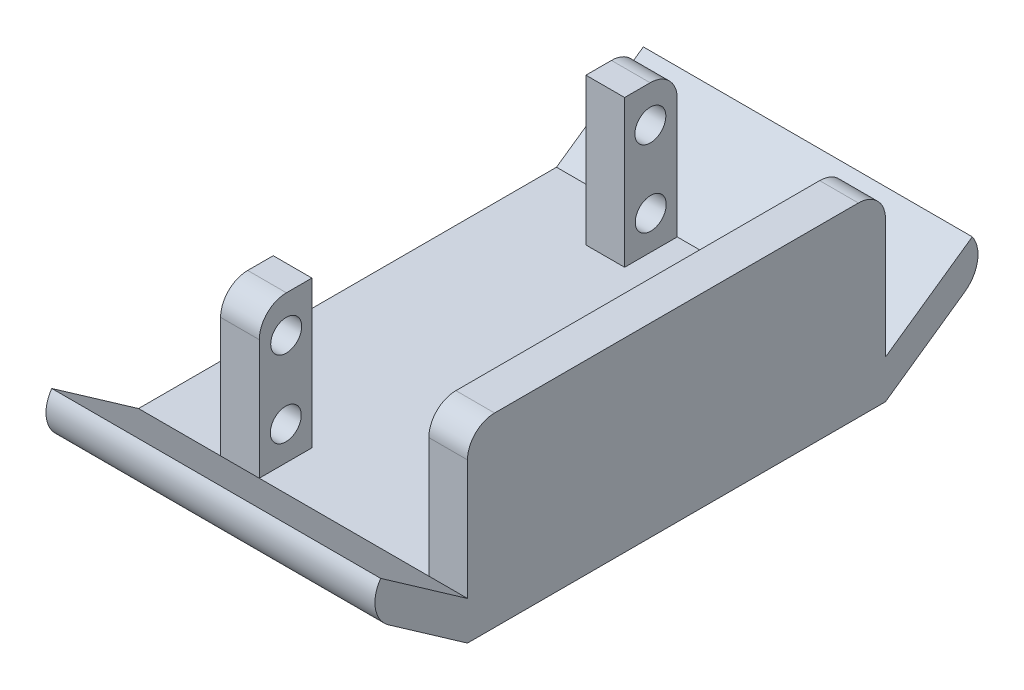
ISO-10303-21;
HEADER;
FILE_DESCRIPTION(('STEP AP214'),'2;1');
FILE_NAME('part.step','',(''),(''),'','','');
FILE_SCHEMA(('AUTOMOTIVE_DESIGN { 1 0 10303 214 1 1 1 1 }'));
ENDSEC;
DATA;
#1=APPLICATION_CONTEXT('core data for automotive mechanical design processes');
#2=APPLICATION_PROTOCOL_DEFINITION('international standard','automotive_design',2000,#1);
#3=PRODUCT_CONTEXT('',#1,'mechanical');
#4=PRODUCT('Part','Part','',(#3));
#5=PRODUCT_RELATED_PRODUCT_CATEGORY('part','',(#4));
#6=PRODUCT_DEFINITION_FORMATION('','',#4);
#7=PRODUCT_DEFINITION_CONTEXT('part definition',#1,'design');
#8=PRODUCT_DEFINITION('design','',#6,#7);
#9=PRODUCT_DEFINITION_SHAPE('','',#8);
#10=(LENGTH_UNIT() NAMED_UNIT(*) SI_UNIT(.MILLI.,.METRE.));
#11=(NAMED_UNIT(*) PLANE_ANGLE_UNIT() SI_UNIT($,.RADIAN.));
#12=(NAMED_UNIT(*) SI_UNIT($,.STERADIAN.) SOLID_ANGLE_UNIT());
#13=UNCERTAINTY_MEASURE_WITH_UNIT(LENGTH_MEASURE(1.E-05),#10,'distance_accuracy_value','');
#14=(GEOMETRIC_REPRESENTATION_CONTEXT(3) GLOBAL_UNCERTAINTY_ASSIGNED_CONTEXT((#13)) GLOBAL_UNIT_ASSIGNED_CONTEXT((#10,
#11,#12)) REPRESENTATION_CONTEXT('',''));
#15=CARTESIAN_POINT('',(0.,0.,0.));
#16=DIRECTION('',(0.,0.,1.));
#17=DIRECTION('',(1.,0.,0.));
#18=AXIS2_PLACEMENT_3D('',#15,#16,#17);
#19=CARTESIAN_POINT('',(31.9,-5.,-6.8));
#20=DIRECTION('',(0.,0.,-1.));
#21=DIRECTION('',(-1.,0.,0.));
#22=AXIS2_PLACEMENT_3D('',#19,#20,#21);
#23=PLANE('',#22);
#24=DIRECTION('',(-1.,0.,0.));
#25=VECTOR('',#24,1.);
#26=CARTESIAN_POINT('',(31.9,0.,-6.8));
#27=LINE('',#26,#25);
#28=CARTESIAN_POINT('',(5.00000000000001,0.,-6.8));
#29=VERTEX_POINT('',#28);
#30=CARTESIAN_POINT('',(0.,0.,-6.8));
#31=VERTEX_POINT('',#30);
#32=EDGE_CURVE('E207',#29,#31,#27,.T.);
#33=ORIENTED_EDGE('',*,*,#32,.T.);
#34=DIRECTION('',(0.,-1.,0.));
#35=VECTOR('',#34,1.);
#36=CARTESIAN_POINT('',(0.,19.,-6.8));
#37=LINE('',#36,#35);
#38=CARTESIAN_POINT('',(0.,15.5,-6.8));
#39=VERTEX_POINT('',#38);
#40=EDGE_CURVE('E295',#39,#31,#37,.T.);
#41=ORIENTED_EDGE('',*,*,#40,.F.);
#42=DIRECTION('',(-1.,0.,0.));
#43=VECTOR('',#42,1.);
#44=CARTESIAN_POINT('',(31.9,15.5,-6.8));
#45=LINE('',#44,#43);
#46=CARTESIAN_POINT('',(5.00000000000001,15.5,-6.8));
#47=VERTEX_POINT('',#46);
#48=EDGE_CURVE('E332',#39,#47,#45,.F.);
#49=ORIENTED_EDGE('',*,*,#48,.T.);
#50=DIRECTION('',(0.,-1.,0.));
#51=VECTOR('',#50,1.);
#52=CARTESIAN_POINT('',(5.00000000000001,19.,-6.8));
#53=LINE('',#52,#51);
#54=EDGE_CURVE('E280',#47,#29,#53,.T.);
#55=ORIENTED_EDGE('',*,*,#54,.T.);
#56=EDGE_LOOP('',(#33,#41,#49,#55));
#57=FACE_BOUND('',#56,.T.);
#58=ADVANCED_FACE('F33',(#57),#23,.T.);
#59=CARTESIAN_POINT('',(31.9,-5.,47.2));
#60=DIRECTION('',(0.,0.,1.));
#61=DIRECTION('',(1.,0.,0.));
#62=AXIS2_PLACEMENT_3D('',#59,#60,#61);
#63=PLANE('',#62);
#64=DIRECTION('',(-1.,0.,0.));
#65=VECTOR('',#64,1.);
#66=CARTESIAN_POINT('',(31.9,0.,47.2));
#67=LINE('',#66,#65);
#68=CARTESIAN_POINT('',(31.9,0.,47.2));
#69=VERTEX_POINT('',#68);
#70=CARTESIAN_POINT('',(26.9,0.,47.2));
#71=VERTEX_POINT('',#70);
#72=EDGE_CURVE('E226',#69,#71,#67,.T.);
#73=ORIENTED_EDGE('',*,*,#72,.F.);
#74=DIRECTION('',(0.,1.,0.));
#75=VECTOR('',#74,1.);
#76=CARTESIAN_POINT('',(31.9,-5.,47.2));
#77=LINE('',#76,#75);
#78=CARTESIAN_POINT('',(31.9,15.5,47.2));
#79=VERTEX_POINT('',#78);
#80=EDGE_CURVE('E319',#69,#79,#77,.T.);
#81=ORIENTED_EDGE('',*,*,#80,.T.);
#82=DIRECTION('',(1.,0.,0.));
#83=VECTOR('',#82,1.);
#84=CARTESIAN_POINT('',(26.9,15.5,47.2));
#85=LINE('',#84,#83);
#86=CARTESIAN_POINT('',(26.9,15.5,47.2));
#87=VERTEX_POINT('',#86);
#88=EDGE_CURVE('E354',#79,#87,#85,.F.);
#89=ORIENTED_EDGE('',*,*,#88,.T.);
#90=DIRECTION('',(0.,-1.,0.));
#91=VECTOR('',#90,1.);
#92=CARTESIAN_POINT('',(26.9,19.,47.2));
#93=LINE('',#92,#91);
#94=EDGE_CURVE('E239',#87,#71,#93,.T.);
#95=ORIENTED_EDGE('',*,*,#94,.T.);
#96=EDGE_LOOP('',(#73,#81,#89,#95));
#97=FACE_BOUND('',#96,.T.);
#98=ADVANCED_FACE('F454',(#97),#63,.T.);
#99=CARTESIAN_POINT('',(0.,0.,0.));
#100=DIRECTION('',(0.,1.,0.));
#101=DIRECTION('',(0.,0.,1.));
#102=AXIS2_PLACEMENT_3D('',#99,#100,#101);
#103=PLANE('',#102);
#104=DIRECTION('',(1.,0.,0.));
#105=VECTOR('',#104,1.);
#106=CARTESIAN_POINT('',(31.9,0.,47.2));
#107=LINE('',#106,#105);
#108=CARTESIAN_POINT('',(5.00000000000001,0.,47.2));
#109=VERTEX_POINT('',#108);
#110=EDGE_CURVE('E316',#109,#71,#107,.T.);
#111=ORIENTED_EDGE('',*,*,#110,.T.);
#112=DIRECTION('',(0.,0.,1.));
#113=VECTOR('',#112,1.);
#114=CARTESIAN_POINT('',(26.9,0.,-6.8));
#115=LINE('',#114,#113);
#116=CARTESIAN_POINT('',(26.9,0.,-6.8));
#117=VERTEX_POINT('',#116);
#118=EDGE_CURVE('E229',#117,#71,#115,.T.);
#119=ORIENTED_EDGE('',*,*,#118,.F.);
#120=DIRECTION('',(-1.,0.,0.));
#121=VECTOR('',#120,1.);
#122=CARTESIAN_POINT('',(31.9,0.,-6.8));
#123=LINE('',#122,#121);
#124=EDGE_CURVE('E311',#117,#29,#123,.T.);
#125=ORIENTED_EDGE('',*,*,#124,.T.);
#126=DIRECTION('',(0.,0.,-1.));
#127=VECTOR('',#126,1.);
#128=CARTESIAN_POINT('',(5.00000000000001,0.,0.));
#129=LINE('',#128,#127);
#130=CARTESIAN_POINT('',(5.00000000000001,0.,0.));
#131=VERTEX_POINT('',#130);
#132=EDGE_CURVE('E275',#131,#29,#129,.T.);
#133=ORIENTED_EDGE('',*,*,#132,.F.);
#134=DIRECTION('',(1.,0.,0.));
#135=VECTOR('',#134,1.);
#136=CARTESIAN_POINT('',(0.,0.,0.));
#137=LINE('',#136,#135);
#138=CARTESIAN_POINT('',(0.,0.,0.));
#139=VERTEX_POINT('',#138);
#140=EDGE_CURVE('E283',#139,#131,#137,.T.);
#141=ORIENTED_EDGE('',*,*,#140,.F.);
#142=DIRECTION('',(0.,0.,1.));
#143=VECTOR('',#142,1.);
#144=CARTESIAN_POINT('',(0.,0.,0.));
#145=LINE('',#144,#143);
#146=EDGE_CURVE('E271',#31,#139,#145,.T.);
#147=ORIENTED_EDGE('',*,*,#146,.F.);
#148=CARTESIAN_POINT('',(-10.6,0.,-6.8));
#149=VERTEX_POINT('',#148);
#150=EDGE_CURVE('E298',#31,#149,#123,.T.);
#151=ORIENTED_EDGE('',*,*,#150,.T.);
#152=DIRECTION('',(0.,0.,1.));
#153=VECTOR('',#152,1.);
#154=CARTESIAN_POINT('',(-10.6,0.,47.2));
#155=LINE('',#154,#153);
#156=CARTESIAN_POINT('',(-10.6,0.,47.2));
#157=VERTEX_POINT('',#156);
#158=EDGE_CURVE('E314',#149,#157,#155,.T.);
#159=ORIENTED_EDGE('',*,*,#158,.T.);
#160=CARTESIAN_POINT('',(0.,0.,47.2));
#161=VERTEX_POINT('',#160);
#162=EDGE_CURVE('E302',#157,#161,#107,.T.);
#163=ORIENTED_EDGE('',*,*,#162,.T.);
#164=DIRECTION('',(0.,0.,1.));
#165=VECTOR('',#164,1.);
#166=CARTESIAN_POINT('',(0.,0.,40.4));
#167=LINE('',#166,#165);
#168=CARTESIAN_POINT('',(0.,0.,40.4));
#169=VERTEX_POINT('',#168);
#170=EDGE_CURVE('E246',#169,#161,#167,.T.);
#171=ORIENTED_EDGE('',*,*,#170,.F.);
#172=DIRECTION('',(-1.,0.,0.));
#173=VECTOR('',#172,1.);
#174=CARTESIAN_POINT('',(0.,0.,40.4));
#175=LINE('',#174,#173);
#176=CARTESIAN_POINT('',(5.00000000000001,0.,40.4));
#177=VERTEX_POINT('',#176);
#178=EDGE_CURVE('E251',#177,#169,#175,.T.);
#179=ORIENTED_EDGE('',*,*,#178,.F.);
#180=DIRECTION('',(0.,0.,-1.));
#181=VECTOR('',#180,1.);
#182=CARTESIAN_POINT('',(5.00000000000001,0.,40.4));
#183=LINE('',#182,#181);
#184=EDGE_CURVE('E258',#109,#177,#183,.T.);
#185=ORIENTED_EDGE('',*,*,#184,.F.);
#186=EDGE_LOOP('',(#111,#119,#125,#133,#141,#147,#151,#159,#163,#171,#179,#185));
#187=FACE_BOUND('',#186,.T.);
#188=ADVANCED_FACE('F385',(#187),#103,.T.);
#189=CARTESIAN_POINT('',(31.9,-5.,47.2));
#190=DIRECTION('',(1.,0.,0.));
#191=DIRECTION('',(0.,0.,-1.));
#192=AXIS2_PLACEMENT_3D('',#189,#190,#191);
#193=PLANE('',#192);
#194=DIRECTION('',(0.,-0.57357643635105,-0.819152044288989));
#195=VECTOR('',#194,1.);
#196=CARTESIAN_POINT('',(31.9,7.85505035831426,58.4181745120853));
#197=LINE('',#196,#195);
#198=CARTESIAN_POINT('',(31.9,7.85505035831426,58.4181745120853));
#199=VERTEX_POINT('',#198);
#200=EDGE_CURVE('E216',#199,#69,#197,.T.);
#201=ORIENTED_EDGE('',*,*,#200,.F.);
#202=CARTESIAN_POINT('',(31.9,5.50686124991796,55.0572210891398));
#203=DIRECTION('',(1.,0.,0.));
#204=DIRECTION('',(0.,0.,-1.));
#205=AXIS2_PLACEMENT_3D('',#202,#203,#204);
#206=CIRCLE('',#205,4.1);
#207=CARTESIAN_POINT('',(31.9,2.14833786833309,57.4088844781791));
#208=VERTEX_POINT('',#207);
#209=EDGE_CURVE('E41',#199,#208,#206,.T.);
#210=ORIENTED_EDGE('',*,*,#209,.T.);
#211=DIRECTION('',(0.,0.573576436351044,0.819152044288993));
#212=VECTOR('',#211,1.);
#213=CARTESIAN_POINT('',(31.9,-5.,47.2));
#214=LINE('',#213,#212);
#215=CARTESIAN_POINT('',(31.9,-5.,47.2));
#216=VERTEX_POINT('',#215);
#217=EDGE_CURVE('E213',#216,#208,#214,.T.);
#218=ORIENTED_EDGE('',*,*,#217,.F.);
#219=DIRECTION('',(0.,0.,-1.));
#220=VECTOR('',#219,1.);
#221=CARTESIAN_POINT('',(31.9,-5.,47.2));
#222=LINE('',#221,#220);
#223=CARTESIAN_POINT('',(31.9,-5.,-6.8));
#224=VERTEX_POINT('',#223);
#225=EDGE_CURVE('E299',#216,#224,#222,.T.);
#226=ORIENTED_EDGE('',*,*,#225,.T.);
#227=DIRECTION('',(0.,-0.573576436351044,0.819152044288993));
#228=VECTOR('',#227,1.);
#229=CARTESIAN_POINT('',(31.9,-5.00000000000002,-6.8));
#230=LINE('',#229,#228);
#231=CARTESIAN_POINT('',(31.9,2.14833786833306,-17.0088844781791));
#232=VERTEX_POINT('',#231);
#233=EDGE_CURVE('E192',#232,#224,#230,.T.);
#234=ORIENTED_EDGE('',*,*,#233,.F.);
#235=CARTESIAN_POINT('',(31.9,5.50686124991794,-14.6572210891398));
#236=DIRECTION('',(1.,0.,0.));
#237=DIRECTION('',(0.,0.,-1.));
#238=AXIS2_PLACEMENT_3D('',#235,#236,#237);
#239=CIRCLE('',#238,4.1);
#240=CARTESIAN_POINT('',(31.9,7.85505035831424,-18.0181745120853));
#241=VERTEX_POINT('',#240);
#242=EDGE_CURVE('E186',#232,#241,#239,.T.);
#243=ORIENTED_EDGE('',*,*,#242,.T.);
#244=DIRECTION('',(0.,0.57357643635105,-0.819152044288989));
#245=VECTOR('',#244,1.);
#246=CARTESIAN_POINT('',(31.9,7.85505035831424,-18.0181745120853));
#247=LINE('',#246,#245);
#248=CARTESIAN_POINT('',(31.9,0.,-6.8));
#249=VERTEX_POINT('',#248);
#250=EDGE_CURVE('E190',#249,#241,#247,.T.);
#251=ORIENTED_EDGE('',*,*,#250,.F.);
#252=DIRECTION('',(0.,1.,0.));
#253=VECTOR('',#252,1.);
#254=CARTESIAN_POINT('',(31.9,-5.,-6.8));
#255=LINE('',#254,#253);
#256=CARTESIAN_POINT('',(31.9,15.5,-6.8));
#257=VERTEX_POINT('',#256);
#258=EDGE_CURVE('E310',#249,#257,#255,.T.);
#259=ORIENTED_EDGE('',*,*,#258,.T.);
#260=CARTESIAN_POINT('',(31.9,15.5,-3.3));
#261=DIRECTION('',(1.,0.,0.));
#262=DIRECTION('',(0.,0.,-1.));
#263=AXIS2_PLACEMENT_3D('',#260,#261,#262);
#264=CIRCLE('',#263,3.5);
#265=CARTESIAN_POINT('',(31.9,19.,-3.3));
#266=VERTEX_POINT('',#265);
#267=EDGE_CURVE('E340',#257,#266,#264,.T.);
#268=ORIENTED_EDGE('',*,*,#267,.T.);
#269=DIRECTION('',(0.,0.,-1.));
#270=VECTOR('',#269,1.);
#271=CARTESIAN_POINT('',(31.9,19.,-6.8));
#272=LINE('',#271,#270);
#273=CARTESIAN_POINT('',(31.9,19.,43.7));
#274=VERTEX_POINT('',#273);
#275=EDGE_CURVE('E233',#274,#266,#272,.T.);
#276=ORIENTED_EDGE('',*,*,#275,.F.);
#277=CARTESIAN_POINT('',(31.9,15.5,43.7));
#278=DIRECTION('',(1.,0.,0.));
#279=DIRECTION('',(0.,0.,-1.));
#280=AXIS2_PLACEMENT_3D('',#277,#278,#279);
#281=CIRCLE('',#280,3.5);
#282=EDGE_CURVE('E337',#274,#79,#281,.T.);
#283=ORIENTED_EDGE('',*,*,#282,.T.);
#284=ORIENTED_EDGE('',*,*,#80,.F.);
#285=EDGE_LOOP('',(#201,#210,#218,#226,#234,#243,#251,#259,#268,#276,#283,#284));
#286=FACE_BOUND('',#285,.T.);
#287=ADVANCED_FACE('F189',(#286),#193,.T.);
#288=EDGE_CURVE('E230',#109,#161,#67,.T.);
#289=ORIENTED_EDGE('',*,*,#288,.F.);
#290=DIRECTION('',(0.,-1.,0.));
#291=VECTOR('',#290,1.);
#292=CARTESIAN_POINT('',(5.00000000000001,19.,47.2));
#293=LINE('',#292,#291);
#294=CARTESIAN_POINT('',(5.00000000000001,15.5,47.2));
#295=VERTEX_POINT('',#294);
#296=EDGE_CURVE('E266',#295,#109,#293,.T.);
#297=ORIENTED_EDGE('',*,*,#296,.F.);
#298=DIRECTION('',(1.,0.,0.));
#299=VECTOR('',#298,1.);
#300=CARTESIAN_POINT('',(31.9,15.5,47.2));
#301=LINE('',#300,#299);
#302=CARTESIAN_POINT('',(0.,15.5,47.2));
#303=VERTEX_POINT('',#302);
#304=EDGE_CURVE('E356',#295,#303,#301,.F.);
#305=ORIENTED_EDGE('',*,*,#304,.T.);
#306=DIRECTION('',(0.,-1.,0.));
#307=VECTOR('',#306,1.);
#308=CARTESIAN_POINT('',(0.,19.,47.2));
#309=LINE('',#308,#307);
#310=EDGE_CURVE('E269',#303,#161,#309,.T.);
#311=ORIENTED_EDGE('',*,*,#310,.T.);
#312=EDGE_LOOP('',(#289,#297,#305,#311));
#313=FACE_BOUND('',#312,.T.);
#314=ADVANCED_FACE('F504',(#313),#63,.T.);
#315=CARTESIAN_POINT('',(-10.6,-5.,47.2));
#316=DIRECTION('',(-1.,0.,0.));
#317=DIRECTION('',(0.,0.,1.));
#318=AXIS2_PLACEMENT_3D('',#315,#316,#317);
#319=PLANE('',#318);
#320=DIRECTION('',(0.,0.573576436351044,0.819152044288993));
#321=VECTOR('',#320,1.);
#322=CARTESIAN_POINT('',(-10.6,-5.,47.2));
#323=LINE('',#322,#321);
#324=CARTESIAN_POINT('',(-10.6,-5.,47.2));
#325=VERTEX_POINT('',#324);
#326=CARTESIAN_POINT('',(-10.6,2.14833786833309,57.4088844781791));
#327=VERTEX_POINT('',#326);
#328=EDGE_CURVE('E221',#325,#327,#323,.T.);
#329=ORIENTED_EDGE('',*,*,#328,.T.);
#330=CARTESIAN_POINT('',(-10.6,5.50686124991796,55.0572210891398));
#331=DIRECTION('',(-1.,0.,0.));
#332=DIRECTION('',(0.,0.,1.));
#333=AXIS2_PLACEMENT_3D('',#330,#331,#332);
#334=CIRCLE('',#333,4.1);
#335=CARTESIAN_POINT('',(-10.6,7.85505035831426,58.4181745120853));
#336=VERTEX_POINT('',#335);
#337=EDGE_CURVE('E195',#327,#336,#334,.T.);
#338=ORIENTED_EDGE('',*,*,#337,.T.);
#339=DIRECTION('',(0.,-0.57357643635105,-0.819152044288989));
#340=VECTOR('',#339,1.);
#341=CARTESIAN_POINT('',(-10.6,7.85505035831426,58.4181745120853));
#342=LINE('',#341,#340);
#343=EDGE_CURVE('E217',#336,#157,#342,.T.);
#344=ORIENTED_EDGE('',*,*,#343,.T.);
#345=ORIENTED_EDGE('',*,*,#158,.F.);
#346=DIRECTION('',(0.,0.57357643635105,-0.819152044288989));
#347=VECTOR('',#346,1.);
#348=CARTESIAN_POINT('',(-10.6,7.85505035831424,-18.0181745120853));
#349=LINE('',#348,#347);
#350=CARTESIAN_POINT('',(-10.6,7.85505035831424,-18.0181745120853));
#351=VERTEX_POINT('',#350);
#352=EDGE_CURVE('E389',#149,#351,#349,.T.);
#353=ORIENTED_EDGE('',*,*,#352,.T.);
#354=CARTESIAN_POINT('',(-10.6,5.50686124991794,-14.6572210891398));
#355=DIRECTION('',(-1.,0.,0.));
#356=DIRECTION('',(0.,0.,1.));
#357=AXIS2_PLACEMENT_3D('',#354,#355,#356);
#358=CIRCLE('',#357,4.1);
#359=CARTESIAN_POINT('',(-10.6,2.14833786833307,-17.0088844781791));
#360=VERTEX_POINT('',#359);
#361=EDGE_CURVE('E54',#351,#360,#358,.T.);
#362=ORIENTED_EDGE('',*,*,#361,.T.);
#363=DIRECTION('',(0.,-0.573576436351044,0.819152044288993));
#364=VECTOR('',#363,1.);
#365=CARTESIAN_POINT('',(-10.6,-5.00000000000002,-6.8));
#366=LINE('',#365,#364);
#367=CARTESIAN_POINT('',(-10.6,-5.00000000000002,-6.8));
#368=VERTEX_POINT('',#367);
#369=EDGE_CURVE('E205',#360,#368,#366,.T.);
#370=ORIENTED_EDGE('',*,*,#369,.T.);
#371=DIRECTION('',(0.,0.,1.));
#372=VECTOR('',#371,1.);
#373=CARTESIAN_POINT('',(-10.6,-5.,47.2));
#374=LINE('',#373,#372);
#375=EDGE_CURVE('E305',#368,#325,#374,.T.);
#376=ORIENTED_EDGE('',*,*,#375,.T.);
#377=EDGE_LOOP('',(#329,#338,#344,#345,#353,#362,#370,#376));
#378=FACE_BOUND('',#377,.T.);
#379=ADVANCED_FACE('F375',(#378),#319,.T.);
#380=EDGE_CURVE('E204',#249,#117,#27,.T.);
#381=ORIENTED_EDGE('',*,*,#380,.T.);
#382=DIRECTION('',(0.,-1.,0.));
#383=VECTOR('',#382,1.);
#384=CARTESIAN_POINT('',(26.9,19.,-6.8));
#385=LINE('',#384,#383);
#386=CARTESIAN_POINT('',(26.9,15.5,-6.8));
#387=VERTEX_POINT('',#386);
#388=EDGE_CURVE('E243',#387,#117,#385,.T.);
#389=ORIENTED_EDGE('',*,*,#388,.F.);
#390=DIRECTION('',(-1.,0.,0.));
#391=VECTOR('',#390,1.);
#392=CARTESIAN_POINT('',(31.9,15.5,-6.8));
#393=LINE('',#392,#391);
#394=EDGE_CURVE('E334',#387,#257,#393,.F.);
#395=ORIENTED_EDGE('',*,*,#394,.T.);
#396=ORIENTED_EDGE('',*,*,#258,.F.);
#397=EDGE_LOOP('',(#381,#389,#395,#396));
#398=FACE_BOUND('',#397,.T.);
#399=ADVANCED_FACE('F499',(#398),#23,.T.);
#400=CARTESIAN_POINT('',(0.,-5.,0.));
#401=DIRECTION('',(0.,1.,0.));
#402=DIRECTION('',(0.,0.,1.));
#403=AXIS2_PLACEMENT_3D('',#400,#401,#402);
#404=PLANE('',#403);
#405=ORIENTED_EDGE('',*,*,#225,.F.);
#406=DIRECTION('',(1.,0.,0.));
#407=VECTOR('',#406,1.);
#408=CARTESIAN_POINT('',(31.9,-5.,47.2));
#409=LINE('',#408,#407);
#410=EDGE_CURVE('E307',#325,#216,#409,.T.);
#411=ORIENTED_EDGE('',*,*,#410,.F.);
#412=ORIENTED_EDGE('',*,*,#375,.F.);
#413=DIRECTION('',(-1.,0.,0.));
#414=VECTOR('',#413,1.);
#415=CARTESIAN_POINT('',(31.9,-5.,-6.8));
#416=LINE('',#415,#414);
#417=EDGE_CURVE('E301',#224,#368,#416,.T.);
#418=ORIENTED_EDGE('',*,*,#417,.F.);
#419=EDGE_LOOP('',(#405,#411,#412,#418));
#420=FACE_BOUND('',#419,.T.);
#421=ADVANCED_FACE('F508',(#420),#404,.F.);
#422=CARTESIAN_POINT('',(0.,19.,0.));
#423=DIRECTION('',(1.,0.,0.));
#424=DIRECTION('',(0.,0.,-1.));
#425=AXIS2_PLACEMENT_3D('',#422,#423,#424);
#426=PLANE('',#425);
#427=CARTESIAN_POINT('',(0.,4.35890483515786,-3.37705839560443));
#428=DIRECTION('',(-1.,0.,0.));
#429=DIRECTION('',(0.,0.,1.));
#430=AXIS2_PLACEMENT_3D('',#427,#428,#429);
#431=CIRCLE('',#430,2.);
#432=CARTESIAN_POINT('',(0.,4.35890483515786,-1.37705839560443));
#433=VERTEX_POINT('',#432);
#434=EDGE_CURVE('E407',#433,#433,#431,.T.);
#435=ORIENTED_EDGE('',*,*,#434,.F.);
#436=EDGE_LOOP('',(#435));
#437=FACE_BOUND('',#436,.T.);
#438=CARTESIAN_POINT('',(0.,14.2589048351579,-3.32495313244653));
#439=DIRECTION('',(-1.,0.,0.));
#440=DIRECTION('',(0.,0.,1.));
#441=AXIS2_PLACEMENT_3D('',#438,#439,#440);
#442=CIRCLE('',#441,2.);
#443=CARTESIAN_POINT('',(0.,14.2589048351579,-1.32495313244653));
#444=VERTEX_POINT('',#443);
#445=EDGE_CURVE('E394',#444,#444,#442,.T.);
#446=ORIENTED_EDGE('',*,*,#445,.F.);
#447=EDGE_LOOP('',(#446));
#448=FACE_BOUND('',#447,.T.);
#449=DIRECTION('',(0.,0.,1.));
#450=VECTOR('',#449,1.);
#451=CARTESIAN_POINT('',(0.,19.,0.));
#452=LINE('',#451,#450);
#453=CARTESIAN_POINT('',(0.,19.,-3.3));
#454=VERTEX_POINT('',#453);
#455=CARTESIAN_POINT('',(0.,19.,0.));
#456=VERTEX_POINT('',#455);
#457=EDGE_CURVE('E272',#454,#456,#452,.T.);
#458=ORIENTED_EDGE('',*,*,#457,.F.);
#459=CARTESIAN_POINT('',(0.,15.5,-3.3));
#460=DIRECTION('',(1.,0.,0.));
#461=DIRECTION('',(0.,0.,-1.));
#462=AXIS2_PLACEMENT_3D('',#459,#460,#461);
#463=CIRCLE('',#462,3.5);
#464=EDGE_CURVE('E345',#454,#39,#463,.F.);
#465=ORIENTED_EDGE('',*,*,#464,.T.);
#466=ORIENTED_EDGE('',*,*,#40,.T.);
#467=ORIENTED_EDGE('',*,*,#146,.T.);
#468=DIRECTION('',(0.,-1.,0.));
#469=VECTOR('',#468,1.);
#470=CARTESIAN_POINT('',(0.,19.,0.));
#471=LINE('',#470,#469);
#472=EDGE_CURVE('E292',#456,#139,#471,.T.);
#473=ORIENTED_EDGE('',*,*,#472,.F.);
#474=EDGE_LOOP('',(#458,#465,#466,#467,#473));
#475=FACE_BOUND('',#474,.T.);
#476=ADVANCED_FACE('F472',(#437,#448,#475),#426,.F.);
#477=CARTESIAN_POINT('',(0.,19.,0.));
#478=DIRECTION('',(0.,0.,-1.));
#479=DIRECTION('',(-1.,0.,0.));
#480=AXIS2_PLACEMENT_3D('',#477,#478,#479);
#481=PLANE('',#480);
#482=ORIENTED_EDGE('',*,*,#140,.T.);
#483=DIRECTION('',(0.,-1.,0.));
#484=VECTOR('',#483,1.);
#485=CARTESIAN_POINT('',(5.00000000000001,19.,0.));
#486=LINE('',#485,#484);
#487=CARTESIAN_POINT('',(5.00000000000001,19.,0.));
#488=VERTEX_POINT('',#487);
#489=EDGE_CURVE('E289',#488,#131,#486,.T.);
#490=ORIENTED_EDGE('',*,*,#489,.F.);
#491=DIRECTION('',(1.,0.,0.));
#492=VECTOR('',#491,1.);
#493=CARTESIAN_POINT('',(0.,19.,0.));
#494=LINE('',#493,#492);
#495=EDGE_CURVE('E274',#456,#488,#494,.T.);
#496=ORIENTED_EDGE('',*,*,#495,.F.);
#497=ORIENTED_EDGE('',*,*,#472,.T.);
#498=EDGE_LOOP('',(#482,#490,#496,#497));
#499=FACE_BOUND('',#498,.T.);
#500=ADVANCED_FACE('F476',(#499),#481,.F.);
#501=CARTESIAN_POINT('',(5.00000000000001,19.,0.));
#502=DIRECTION('',(-1.,0.,0.));
#503=DIRECTION('',(0.,0.,1.));
#504=AXIS2_PLACEMENT_3D('',#501,#502,#503);
#505=PLANE('',#504);
#506=CARTESIAN_POINT('',(5.,4.35890483515786,-3.37705839560443));
#507=DIRECTION('',(-1.,0.,0.));
#508=DIRECTION('',(0.,0.,1.));
#509=AXIS2_PLACEMENT_3D('',#506,#507,#508);
#510=CIRCLE('',#509,2.);
#511=CARTESIAN_POINT('',(5.,4.35890483515786,-1.37705839560443));
#512=VERTEX_POINT('',#511);
#513=EDGE_CURVE('E398',#512,#512,#510,.T.);
#514=ORIENTED_EDGE('',*,*,#513,.T.);
#515=EDGE_LOOP('',(#514));
#516=FACE_BOUND('',#515,.T.);
#517=CARTESIAN_POINT('',(5.,14.2589048351579,-3.32495313244653));
#518=DIRECTION('',(-1.,0.,0.));
#519=DIRECTION('',(0.,0.,1.));
#520=AXIS2_PLACEMENT_3D('',#517,#518,#519);
#521=CIRCLE('',#520,2.);
#522=CARTESIAN_POINT('',(5.,14.2589048351579,-1.32495313244653));
#523=VERTEX_POINT('',#522);
#524=EDGE_CURVE('E391',#523,#523,#521,.T.);
#525=ORIENTED_EDGE('',*,*,#524,.T.);
#526=EDGE_LOOP('',(#525));
#527=FACE_BOUND('',#526,.T.);
#528=ORIENTED_EDGE('',*,*,#54,.F.);
#529=CARTESIAN_POINT('',(5.00000000000001,15.5,-3.3));
#530=DIRECTION('',(-1.,0.,0.));
#531=DIRECTION('',(0.,0.,1.));
#532=AXIS2_PLACEMENT_3D('',#529,#530,#531);
#533=CIRCLE('',#532,3.5);
#534=CARTESIAN_POINT('',(5.00000000000001,19.,-3.3));
#535=VERTEX_POINT('',#534);
#536=EDGE_CURVE('E347',#47,#535,#533,.F.);
#537=ORIENTED_EDGE('',*,*,#536,.T.);
#538=DIRECTION('',(0.,0.,-1.));
#539=VECTOR('',#538,1.);
#540=CARTESIAN_POINT('',(5.00000000000001,19.,0.));
#541=LINE('',#540,#539);
#542=EDGE_CURVE('E277',#488,#535,#541,.T.);
#543=ORIENTED_EDGE('',*,*,#542,.F.);
#544=ORIENTED_EDGE('',*,*,#489,.T.);
#545=ORIENTED_EDGE('',*,*,#132,.T.);
#546=EDGE_LOOP('',(#528,#537,#543,#544,#545));
#547=FACE_BOUND('',#546,.T.);
#548=ADVANCED_FACE('F480',(#516,#527,#547),#505,.F.);
#549=CARTESIAN_POINT('',(0.,19.,0.));
#550=DIRECTION('',(0.,1.,0.));
#551=DIRECTION('',(0.,0.,1.));
#552=AXIS2_PLACEMENT_3D('',#549,#550,#551);
#553=PLANE('',#552);
#554=ORIENTED_EDGE('',*,*,#542,.T.);
#555=DIRECTION('',(-1.,0.,0.));
#556=VECTOR('',#555,1.);
#557=CARTESIAN_POINT('',(0.,19.,-3.3));
#558=LINE('',#557,#556);
#559=EDGE_CURVE('E342',#535,#454,#558,.T.);
#560=ORIENTED_EDGE('',*,*,#559,.T.);
#561=ORIENTED_EDGE('',*,*,#457,.T.);
#562=ORIENTED_EDGE('',*,*,#495,.T.);
#563=EDGE_LOOP('',(#554,#560,#561,#562));
#564=FACE_BOUND('',#563,.T.);
#565=ADVANCED_FACE('F431',(#564),#553,.T.);
#566=CARTESIAN_POINT('',(0.,19.,40.4));
#567=DIRECTION('',(1.,0.,0.));
#568=DIRECTION('',(0.,0.,-1.));
#569=AXIS2_PLACEMENT_3D('',#566,#567,#568);
#570=PLANE('',#569);
#571=CARTESIAN_POINT('',(0.,14.2589048351579,43.7249531324465));
#572=DIRECTION('',(-1.,0.,0.));
#573=DIRECTION('',(0.,0.,1.));
#574=AXIS2_PLACEMENT_3D('',#571,#572,#573);
#575=CIRCLE('',#574,2.);
#576=CARTESIAN_POINT('',(0.,14.2589048351579,45.7249531324465));
#577=VERTEX_POINT('',#576);
#578=EDGE_CURVE('E400',#577,#577,#575,.T.);
#579=ORIENTED_EDGE('',*,*,#578,.F.);
#580=EDGE_LOOP('',(#579));
#581=FACE_BOUND('',#580,.T.);
#582=CARTESIAN_POINT('',(0.,4.35890483515786,43.7770583956044));
#583=DIRECTION('',(-1.,0.,0.));
#584=DIRECTION('',(0.,0.,1.));
#585=AXIS2_PLACEMENT_3D('',#582,#583,#584);
#586=CIRCLE('',#585,2.);
#587=CARTESIAN_POINT('',(0.,4.35890483515786,45.7770583956044));
#588=VERTEX_POINT('',#587);
#589=EDGE_CURVE('E412',#588,#588,#586,.T.);
#590=ORIENTED_EDGE('',*,*,#589,.F.);
#591=EDGE_LOOP('',(#590));
#592=FACE_BOUND('',#591,.T.);
#593=ORIENTED_EDGE('',*,*,#310,.F.);
#594=CARTESIAN_POINT('',(0.,15.5,43.7));
#595=DIRECTION('',(1.,0.,0.));
#596=DIRECTION('',(0.,0.,-1.));
#597=AXIS2_PLACEMENT_3D('',#594,#595,#596);
#598=CIRCLE('',#597,3.5);
#599=CARTESIAN_POINT('',(0.,19.,43.7));
#600=VERTEX_POINT('',#599);
#601=EDGE_CURVE('E358',#303,#600,#598,.F.);
#602=ORIENTED_EDGE('',*,*,#601,.T.);
#603=DIRECTION('',(0.,0.,1.));
#604=VECTOR('',#603,1.);
#605=CARTESIAN_POINT('',(0.,19.,40.4));
#606=LINE('',#605,#604);
#607=CARTESIAN_POINT('',(0.,19.,40.4));
#608=VERTEX_POINT('',#607);
#609=EDGE_CURVE('E247',#608,#600,#606,.T.);
#610=ORIENTED_EDGE('',*,*,#609,.F.);
#611=DIRECTION('',(0.,-1.,0.));
#612=VECTOR('',#611,1.);
#613=CARTESIAN_POINT('',(0.,19.,40.4));
#614=LINE('',#613,#612);
#615=EDGE_CURVE('E255',#608,#169,#614,.T.);
#616=ORIENTED_EDGE('',*,*,#615,.T.);
#617=ORIENTED_EDGE('',*,*,#170,.T.);
#618=EDGE_LOOP('',(#593,#602,#610,#616,#617));
#619=FACE_BOUND('',#618,.T.);
#620=ADVANCED_FACE('F428',(#581,#592,#619),#570,.F.);
#621=CARTESIAN_POINT('',(5.00000000000001,19.,40.4));
#622=DIRECTION('',(-1.,0.,0.));
#623=DIRECTION('',(0.,0.,1.));
#624=AXIS2_PLACEMENT_3D('',#621,#622,#623);
#625=PLANE('',#624);
#626=CARTESIAN_POINT('',(5.,14.2589048351579,43.7249531324465));
#627=DIRECTION('',(-1.,0.,0.));
#628=DIRECTION('',(0.,0.,1.));
#629=AXIS2_PLACEMENT_3D('',#626,#627,#628);
#630=CIRCLE('',#629,2.);
#631=CARTESIAN_POINT('',(5.,14.2589048351579,45.7249531324465));
#632=VERTEX_POINT('',#631);
#633=EDGE_CURVE('E403',#632,#632,#630,.T.);
#634=ORIENTED_EDGE('',*,*,#633,.T.);
#635=EDGE_LOOP('',(#634));
#636=FACE_BOUND('',#635,.T.);
#637=CARTESIAN_POINT('',(5.,4.35890483515786,43.7770583956044));
#638=DIRECTION('',(-1.,0.,0.));
#639=DIRECTION('',(0.,0.,1.));
#640=AXIS2_PLACEMENT_3D('',#637,#638,#639);
#641=CIRCLE('',#640,2.);
#642=CARTESIAN_POINT('',(5.,4.35890483515786,45.7770583956044));
#643=VERTEX_POINT('',#642);
#644=EDGE_CURVE('E404',#643,#643,#641,.T.);
#645=ORIENTED_EDGE('',*,*,#644,.T.);
#646=EDGE_LOOP('',(#645));
#647=FACE_BOUND('',#646,.T.);
#648=DIRECTION('',(0.,0.,-1.));
#649=VECTOR('',#648,1.);
#650=CARTESIAN_POINT('',(5.00000000000001,19.,40.4));
#651=LINE('',#650,#649);
#652=CARTESIAN_POINT('',(5.00000000000001,19.,43.7));
#653=VERTEX_POINT('',#652);
#654=CARTESIAN_POINT('',(5.00000000000001,19.,40.4));
#655=VERTEX_POINT('',#654);
#656=EDGE_CURVE('E250',#653,#655,#651,.T.);
#657=ORIENTED_EDGE('',*,*,#656,.F.);
#658=CARTESIAN_POINT('',(5.00000000000001,15.5,43.7));
#659=DIRECTION('',(-1.,0.,0.));
#660=DIRECTION('',(0.,0.,1.));
#661=AXIS2_PLACEMENT_3D('',#658,#659,#660);
#662=CIRCLE('',#661,3.5);
#663=EDGE_CURVE('E352',#653,#295,#662,.F.);
#664=ORIENTED_EDGE('',*,*,#663,.T.);
#665=ORIENTED_EDGE('',*,*,#296,.T.);
#666=ORIENTED_EDGE('',*,*,#184,.T.);
#667=DIRECTION('',(0.,-1.,0.));
#668=VECTOR('',#667,1.);
#669=CARTESIAN_POINT('',(5.00000000000001,19.,40.4));
#670=LINE('',#669,#668);
#671=EDGE_CURVE('E264',#655,#177,#670,.T.);
#672=ORIENTED_EDGE('',*,*,#671,.F.);
#673=EDGE_LOOP('',(#657,#664,#665,#666,#672));
#674=FACE_BOUND('',#673,.T.);
#675=ADVANCED_FACE('F418',(#636,#647,#674),#625,.F.);
#676=CARTESIAN_POINT('',(0.,19.,40.4));
#677=DIRECTION('',(0.,0.,1.));
#678=DIRECTION('',(1.,0.,0.));
#679=AXIS2_PLACEMENT_3D('',#676,#677,#678);
#680=PLANE('',#679);
#681=ORIENTED_EDGE('',*,*,#178,.T.);
#682=ORIENTED_EDGE('',*,*,#615,.F.);
#683=DIRECTION('',(-1.,0.,0.));
#684=VECTOR('',#683,1.);
#685=CARTESIAN_POINT('',(0.,19.,40.4));
#686=LINE('',#685,#684);
#687=EDGE_CURVE('E253',#655,#608,#686,.T.);
#688=ORIENTED_EDGE('',*,*,#687,.F.);
#689=ORIENTED_EDGE('',*,*,#671,.T.);
#690=EDGE_LOOP('',(#681,#682,#688,#689));
#691=FACE_BOUND('',#690,.T.);
#692=ADVANCED_FACE('F451',(#691),#680,.F.);
#693=CARTESIAN_POINT('',(0.,19.,0.));
#694=DIRECTION('',(0.,1.,0.));
#695=DIRECTION('',(0.,0.,1.));
#696=AXIS2_PLACEMENT_3D('',#693,#694,#695);
#697=PLANE('',#696);
#698=ORIENTED_EDGE('',*,*,#609,.T.);
#699=DIRECTION('',(1.,0.,0.));
#700=VECTOR('',#699,1.);
#701=CARTESIAN_POINT('',(0.,19.,43.7));
#702=LINE('',#701,#700);
#703=EDGE_CURVE('E349',#600,#653,#702,.T.);
#704=ORIENTED_EDGE('',*,*,#703,.T.);
#705=ORIENTED_EDGE('',*,*,#656,.T.);
#706=ORIENTED_EDGE('',*,*,#687,.T.);
#707=EDGE_LOOP('',(#698,#704,#705,#706));
#708=FACE_BOUND('',#707,.T.);
#709=ADVANCED_FACE('F444',(#708),#697,.T.);
#710=CARTESIAN_POINT('',(26.9,19.,-6.8));
#711=DIRECTION('',(1.,0.,0.));
#712=DIRECTION('',(0.,0.,-1.));
#713=AXIS2_PLACEMENT_3D('',#710,#711,#712);
#714=PLANE('',#713);
#715=DIRECTION('',(0.,0.,1.));
#716=VECTOR('',#715,1.);
#717=CARTESIAN_POINT('',(26.9,19.,-6.8));
#718=LINE('',#717,#716);
#719=CARTESIAN_POINT('',(26.9,19.,-3.3));
#720=VERTEX_POINT('',#719);
#721=CARTESIAN_POINT('',(26.9,19.,43.7));
#722=VERTEX_POINT('',#721);
#723=EDGE_CURVE('E236',#720,#722,#718,.T.);
#724=ORIENTED_EDGE('',*,*,#723,.F.);
#725=CARTESIAN_POINT('',(26.9,15.5,-3.3));
#726=DIRECTION('',(1.,0.,0.));
#727=DIRECTION('',(0.,0.,-1.));
#728=AXIS2_PLACEMENT_3D('',#725,#726,#727);
#729=CIRCLE('',#728,3.5);
#730=EDGE_CURVE('E330',#720,#387,#729,.F.);
#731=ORIENTED_EDGE('',*,*,#730,.T.);
#732=ORIENTED_EDGE('',*,*,#388,.T.);
#733=ORIENTED_EDGE('',*,*,#118,.T.);
#734=ORIENTED_EDGE('',*,*,#94,.F.);
#735=CARTESIAN_POINT('',(26.9,15.5,43.7));
#736=DIRECTION('',(1.,0.,0.));
#737=DIRECTION('',(0.,0.,-1.));
#738=AXIS2_PLACEMENT_3D('',#735,#736,#737);
#739=CIRCLE('',#738,3.5);
#740=EDGE_CURVE('E328',#87,#722,#739,.F.);
#741=ORIENTED_EDGE('',*,*,#740,.T.);
#742=EDGE_LOOP('',(#724,#731,#732,#733,#734,#741));
#743=FACE_BOUND('',#742,.T.);
#744=ADVANCED_FACE('F464',(#743),#714,.F.);
#745=CARTESIAN_POINT('',(0.,19.,0.));
#746=DIRECTION('',(0.,-1.,0.));
#747=DIRECTION('',(0.,0.,-1.));
#748=AXIS2_PLACEMENT_3D('',#745,#746,#747);
#749=PLANE('',#748);
#750=ORIENTED_EDGE('',*,*,#275,.T.);
#751=DIRECTION('',(-1.,0.,0.));
#752=VECTOR('',#751,1.);
#753=CARTESIAN_POINT('',(26.9,19.,-3.3));
#754=LINE('',#753,#752);
#755=EDGE_CURVE('E325',#266,#720,#754,.T.);
#756=ORIENTED_EDGE('',*,*,#755,.T.);
#757=ORIENTED_EDGE('',*,*,#723,.T.);
#758=DIRECTION('',(1.,0.,0.));
#759=VECTOR('',#758,1.);
#760=CARTESIAN_POINT('',(31.9,19.,43.7));
#761=LINE('',#760,#759);
#762=EDGE_CURVE('E321',#722,#274,#761,.T.);
#763=ORIENTED_EDGE('',*,*,#762,.T.);
#764=EDGE_LOOP('',(#750,#756,#757,#763));
#765=FACE_BOUND('',#764,.T.);
#766=ADVANCED_FACE('F494',(#765),#749,.F.);
#767=CARTESIAN_POINT('',(0.,15.5,-3.3));
#768=DIRECTION('',(1.,0.,0.));
#769=DIRECTION('',(0.,0.,-1.));
#770=AXIS2_PLACEMENT_3D('',#767,#768,#769);
#771=CYLINDRICAL_SURFACE('',#770,3.5);
#772=ORIENTED_EDGE('',*,*,#267,.F.);
#773=ORIENTED_EDGE('',*,*,#394,.F.);
#774=ORIENTED_EDGE('',*,*,#730,.F.);
#775=ORIENTED_EDGE('',*,*,#755,.F.);
#776=EDGE_LOOP('',(#772,#773,#774,#775));
#777=FACE_BOUND('',#776,.T.);
#778=ADVANCED_FACE('F487',(#777),#771,.T.);
#779=CARTESIAN_POINT('',(0.,15.5,-3.3));
#780=DIRECTION('',(-1.,0.,0.));
#781=DIRECTION('',(0.,0.,1.));
#782=AXIS2_PLACEMENT_3D('',#779,#780,#781);
#783=CYLINDRICAL_SURFACE('',#782,3.5);
#784=ORIENTED_EDGE('',*,*,#536,.F.);
#785=ORIENTED_EDGE('',*,*,#48,.F.);
#786=ORIENTED_EDGE('',*,*,#464,.F.);
#787=ORIENTED_EDGE('',*,*,#559,.F.);
#788=EDGE_LOOP('',(#784,#785,#786,#787));
#789=FACE_BOUND('',#788,.T.);
#790=ADVANCED_FACE('F485',(#789),#783,.T.);
#791=CARTESIAN_POINT('',(0.,15.5,43.7));
#792=DIRECTION('',(1.,0.,0.));
#793=DIRECTION('',(0.,0.,-1.));
#794=AXIS2_PLACEMENT_3D('',#791,#792,#793);
#795=CYLINDRICAL_SURFACE('',#794,3.5);
#796=ORIENTED_EDGE('',*,*,#601,.F.);
#797=ORIENTED_EDGE('',*,*,#304,.F.);
#798=ORIENTED_EDGE('',*,*,#663,.F.);
#799=ORIENTED_EDGE('',*,*,#703,.F.);
#800=EDGE_LOOP('',(#796,#797,#798,#799));
#801=FACE_BOUND('',#800,.T.);
#802=ADVANCED_FACE('F441',(#801),#795,.T.);
#803=CARTESIAN_POINT('',(0.,15.5,43.7));
#804=DIRECTION('',(-1.,0.,0.));
#805=DIRECTION('',(0.,0.,1.));
#806=AXIS2_PLACEMENT_3D('',#803,#804,#805);
#807=CYLINDRICAL_SURFACE('',#806,3.5);
#808=ORIENTED_EDGE('',*,*,#740,.F.);
#809=ORIENTED_EDGE('',*,*,#88,.F.);
#810=ORIENTED_EDGE('',*,*,#282,.F.);
#811=ORIENTED_EDGE('',*,*,#762,.F.);
#812=EDGE_LOOP('',(#808,#809,#810,#811));
#813=FACE_BOUND('',#812,.T.);
#814=ADVANCED_FACE('F461',(#813),#807,.T.);
#815=CARTESIAN_POINT('',(31.9,-5.,47.2));
#816=DIRECTION('',(0.,-0.819152044288993,0.573576436351044));
#817=DIRECTION('',(0.,-0.573576436351044,-0.819152044288993));
#818=AXIS2_PLACEMENT_3D('',#815,#816,#817);
#819=PLANE('',#818);
#820=ORIENTED_EDGE('',*,*,#217,.T.);
#821=DIRECTION('',(1.,0.,0.));
#822=VECTOR('',#821,1.);
#823=CARTESIAN_POINT('',(-10.6,2.14833786833309,57.4088844781791));
#824=LINE('',#823,#822);
#825=EDGE_CURVE('E360',#208,#327,#824,.F.);
#826=ORIENTED_EDGE('',*,*,#825,.T.);
#827=ORIENTED_EDGE('',*,*,#328,.F.);
#828=ORIENTED_EDGE('',*,*,#410,.T.);
#829=EDGE_LOOP('',(#820,#826,#827,#828));
#830=FACE_BOUND('',#829,.T.);
#831=ADVANCED_FACE('F370',(#830),#819,.T.);
#832=CARTESIAN_POINT('',(31.9,7.85505035831426,58.4181745120853));
#833=DIRECTION('',(0.,0.819152044288989,-0.57357643635105));
#834=DIRECTION('',(0.,0.57357643635105,0.819152044288989));
#835=AXIS2_PLACEMENT_3D('',#832,#833,#834);
#836=PLANE('',#835);
#837=ORIENTED_EDGE('',*,*,#343,.F.);
#838=DIRECTION('',(-1.,0.,0.));
#839=VECTOR('',#838,1.);
#840=CARTESIAN_POINT('',(31.9,7.85505035831426,58.4181745120853));
#841=LINE('',#840,#839);
#842=EDGE_CURVE('E220',#199,#336,#841,.T.);
#843=ORIENTED_EDGE('',*,*,#842,.F.);
#844=ORIENTED_EDGE('',*,*,#200,.T.);
#845=ORIENTED_EDGE('',*,*,#72,.T.);
#846=ORIENTED_EDGE('',*,*,#110,.F.);
#847=ORIENTED_EDGE('',*,*,#288,.T.);
#848=ORIENTED_EDGE('',*,*,#162,.F.);
#849=EDGE_LOOP('',(#837,#843,#844,#845,#846,#847,#848));
#850=FACE_BOUND('',#849,.T.);
#851=ADVANCED_FACE('F379',(#850),#836,.T.);
#852=CARTESIAN_POINT('',(31.9,7.85505035831424,-18.0181745120853));
#853=DIRECTION('',(0.,0.819152044288989,0.573576436351049));
#854=DIRECTION('',(0.,-0.57357643635105,0.81915204428899));
#855=AXIS2_PLACEMENT_3D('',#852,#853,#854);
#856=PLANE('',#855);
#857=ORIENTED_EDGE('',*,*,#352,.F.);
#858=ORIENTED_EDGE('',*,*,#150,.F.);
#859=ORIENTED_EDGE('',*,*,#32,.F.);
#860=ORIENTED_EDGE('',*,*,#124,.F.);
#861=ORIENTED_EDGE('',*,*,#380,.F.);
#862=ORIENTED_EDGE('',*,*,#250,.T.);
#863=DIRECTION('',(-1.,0.,0.));
#864=VECTOR('',#863,1.);
#865=CARTESIAN_POINT('',(31.9,7.85505035831424,-18.0181745120853));
#866=LINE('',#865,#864);
#867=EDGE_CURVE('E202',#241,#351,#866,.T.);
#868=ORIENTED_EDGE('',*,*,#867,.T.);
#869=EDGE_LOOP('',(#857,#858,#859,#860,#861,#862,#868));
#870=FACE_BOUND('',#869,.T.);
#871=ADVANCED_FACE('F201',(#870),#856,.T.);
#872=CARTESIAN_POINT('',(31.9,-5.00000000000002,-6.8));
#873=DIRECTION('',(0.,-0.819152044288993,-0.573576436351044));
#874=DIRECTION('',(0.,0.573576436351044,-0.819152044288993));
#875=AXIS2_PLACEMENT_3D('',#872,#873,#874);
#876=PLANE('',#875);
#877=ORIENTED_EDGE('',*,*,#369,.F.);
#878=DIRECTION('',(-1.,0.,0.));
#879=VECTOR('',#878,1.);
#880=CARTESIAN_POINT('',(31.9,2.14833786833306,-17.0088844781791));
#881=LINE('',#880,#879);
#882=EDGE_CURVE('E11',#360,#232,#881,.F.);
#883=ORIENTED_EDGE('',*,*,#882,.T.);
#884=ORIENTED_EDGE('',*,*,#233,.T.);
#885=ORIENTED_EDGE('',*,*,#417,.T.);
#886=EDGE_LOOP('',(#877,#883,#884,#885));
#887=FACE_BOUND('',#886,.T.);
#888=ADVANCED_FACE('F689',(#887),#876,.T.);
#889=CARTESIAN_POINT('',(31.9,5.50686124991796,55.0572210891398));
#890=DIRECTION('',(-1.,0.,0.));
#891=DIRECTION('',(0.,0.,1.));
#892=AXIS2_PLACEMENT_3D('',#889,#890,#891);
#893=CYLINDRICAL_SURFACE('',#892,4.1);
#894=ORIENTED_EDGE('',*,*,#209,.F.);
#895=ORIENTED_EDGE('',*,*,#842,.T.);
#896=ORIENTED_EDGE('',*,*,#337,.F.);
#897=ORIENTED_EDGE('',*,*,#825,.F.);
#898=EDGE_LOOP('',(#894,#895,#896,#897));
#899=FACE_BOUND('',#898,.T.);
#900=ADVANCED_FACE('F373',(#899),#893,.T.);
#901=CARTESIAN_POINT('',(31.9,5.50686124991794,-14.6572210891398));
#902=DIRECTION('',(1.,0.,0.));
#903=DIRECTION('',(0.,0.,-1.));
#904=AXIS2_PLACEMENT_3D('',#901,#902,#903);
#905=CYLINDRICAL_SURFACE('',#904,4.1);
#906=ORIENTED_EDGE('',*,*,#242,.F.);
#907=ORIENTED_EDGE('',*,*,#882,.F.);
#908=ORIENTED_EDGE('',*,*,#361,.F.);
#909=ORIENTED_EDGE('',*,*,#867,.F.);
#910=EDGE_LOOP('',(#906,#907,#908,#909));
#911=FACE_BOUND('',#910,.T.);
#912=ADVANCED_FACE('F35',(#911),#905,.T.);
#913=CARTESIAN_POINT('',(5.,4.35890483515786,43.7770583956044));
#914=DIRECTION('',(-1.,0.,0.));
#915=DIRECTION('',(0.,0.,1.));
#916=AXIS2_PLACEMENT_3D('',#913,#914,#915);
#917=CYLINDRICAL_SURFACE('',#916,2.);
#918=ORIENTED_EDGE('',*,*,#644,.F.);
#919=EDGE_LOOP('',(#918));
#920=FACE_BOUND('',#919,.T.);
#921=ORIENTED_EDGE('',*,*,#589,.T.);
#922=EDGE_LOOP('',(#921));
#923=FACE_BOUND('',#922,.T.);
#924=ADVANCED_FACE('F421',(#920,#923),#917,.F.);
#925=CARTESIAN_POINT('',(5.,14.2589048351579,43.7249531324465));
#926=DIRECTION('',(-1.,0.,0.));
#927=DIRECTION('',(0.,0.,1.));
#928=AXIS2_PLACEMENT_3D('',#925,#926,#927);
#929=CYLINDRICAL_SURFACE('',#928,2.);
#930=ORIENTED_EDGE('',*,*,#633,.F.);
#931=EDGE_LOOP('',(#930));
#932=FACE_BOUND('',#931,.T.);
#933=ORIENTED_EDGE('',*,*,#578,.T.);
#934=EDGE_LOOP('',(#933));
#935=FACE_BOUND('',#934,.T.);
#936=ADVANCED_FACE('F424',(#932,#935),#929,.F.);
#937=CARTESIAN_POINT('',(5.,14.2589048351579,-3.32495313244653));
#938=DIRECTION('',(-1.,0.,0.));
#939=DIRECTION('',(0.,0.,1.));
#940=AXIS2_PLACEMENT_3D('',#937,#938,#939);
#941=CYLINDRICAL_SURFACE('',#940,2.);
#942=ORIENTED_EDGE('',*,*,#524,.F.);
#943=EDGE_LOOP('',(#942));
#944=FACE_BOUND('',#943,.T.);
#945=ORIENTED_EDGE('',*,*,#445,.T.);
#946=EDGE_LOOP('',(#945));
#947=FACE_BOUND('',#946,.T.);
#948=ADVANCED_FACE('F662',(#944,#947),#941,.F.);
#949=CARTESIAN_POINT('',(5.,4.35890483515786,-3.37705839560443));
#950=DIRECTION('',(-1.,0.,0.));
#951=DIRECTION('',(0.,0.,1.));
#952=AXIS2_PLACEMENT_3D('',#949,#950,#951);
#953=CYLINDRICAL_SURFACE('',#952,2.);
#954=ORIENTED_EDGE('',*,*,#513,.F.);
#955=EDGE_LOOP('',(#954));
#956=FACE_BOUND('',#955,.T.);
#957=ORIENTED_EDGE('',*,*,#434,.T.);
#958=EDGE_LOOP('',(#957));
#959=FACE_BOUND('',#958,.T.);
#960=ADVANCED_FACE('F672',(#956,#959),#953,.F.);
#961=CLOSED_SHELL('',(#58,#98,#188,#287,#314,#379,#399,#421,#476,#500,#548,#565,#620,#675,#692,
#709,#744,#766,#778,#790,#802,#814,#831,#851,#871,#888,#900,#912,#924,#936,#948,#960));
#962=MANIFOLD_SOLID_BREP('B2',#961);
#963=ADVANCED_BREP_SHAPE_REPRESENTATION('',(#18,#962),#14);
#964=SHAPE_DEFINITION_REPRESENTATION(#9,#963);
ENDSEC;
END-ISO-10303-21;
